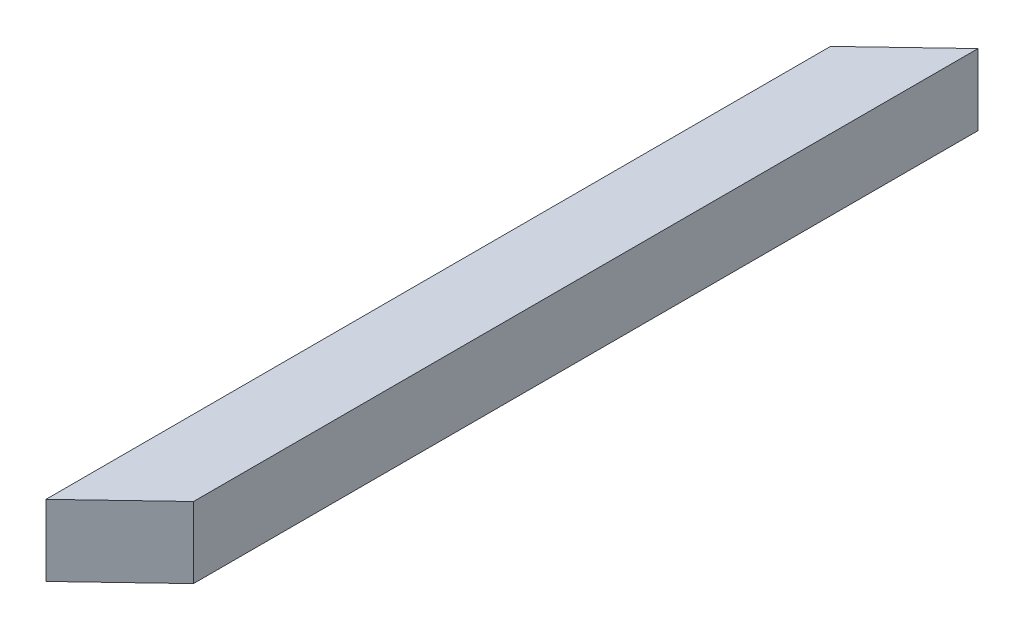
ISO-10303-21;
HEADER;
FILE_DESCRIPTION(('STEP AP214'),'2;1');
FILE_NAME('part.step','',(''),(''),'','','');
FILE_SCHEMA(('AUTOMOTIVE_DESIGN { 1 0 10303 214 1 1 1 1 }'));
ENDSEC;
DATA;
#1=APPLICATION_CONTEXT('core data for automotive mechanical design processes');
#2=APPLICATION_PROTOCOL_DEFINITION('international standard','automotive_design',2000,#1);
#3=PRODUCT_CONTEXT('',#1,'mechanical');
#4=PRODUCT('Part','Part','',(#3));
#5=PRODUCT_RELATED_PRODUCT_CATEGORY('part','',(#4));
#6=PRODUCT_DEFINITION_FORMATION('','',#4);
#7=PRODUCT_DEFINITION_CONTEXT('part definition',#1,'design');
#8=PRODUCT_DEFINITION('design','',#6,#7);
#9=PRODUCT_DEFINITION_SHAPE('','',#8);
#10=(LENGTH_UNIT() NAMED_UNIT(*) SI_UNIT(.MILLI.,.METRE.));
#11=(NAMED_UNIT(*) PLANE_ANGLE_UNIT() SI_UNIT($,.RADIAN.));
#12=(NAMED_UNIT(*) SI_UNIT($,.STERADIAN.) SOLID_ANGLE_UNIT());
#13=UNCERTAINTY_MEASURE_WITH_UNIT(LENGTH_MEASURE(1.E-05),#10,'distance_accuracy_value','');
#14=(GEOMETRIC_REPRESENTATION_CONTEXT(3) GLOBAL_UNCERTAINTY_ASSIGNED_CONTEXT((#13)) GLOBAL_UNIT_ASSIGNED_CONTEXT((#10,
#11,#12)) REPRESENTATION_CONTEXT('',''));
#15=CARTESIAN_POINT('',(0.,0.,0.));
#16=DIRECTION('',(0.,0.,1.));
#17=DIRECTION('',(1.,0.,0.));
#18=AXIS2_PLACEMENT_3D('',#15,#16,#17);
#19=CARTESIAN_POINT('',(-29.8739440592949,25.9887005649717,566.));
#20=DIRECTION('',(1.,0.,0.));
#21=DIRECTION('',(0.,1.,0.));
#22=AXIS2_PLACEMENT_3D('',#19,#20,#21);
#23=PLANE('',#22);
#24=DIRECTION('',(0.,0.,-1.));
#25=VECTOR('',#24,1.);
#26=CARTESIAN_POINT('',(-29.8739440592949,25.9887005649717,566.));
#27=LINE('',#26,#25);
#28=CARTESIAN_POINT('',(-29.8739440592949,25.9887005649717,566.));
#29=VERTEX_POINT('',#28);
#30=CARTESIAN_POINT('',(-29.8739440592949,25.9887005649717,47.4792144086482));
#31=VERTEX_POINT('',#30);
#32=EDGE_CURVE('E75',#29,#31,#27,.T.);
#33=ORIENTED_EDGE('',*,*,#32,.T.);
#34=DIRECTION('',(0.,-1.,0.));
#35=VECTOR('',#34,1.);
#36=CARTESIAN_POINT('',(-29.8739440592949,28.9887005649718,47.4792144086482));
#37=LINE('',#36,#35);
#38=CARTESIAN_POINT('',(-29.8739440592949,-21.0112994350283,47.4792144086482));
#39=VERTEX_POINT('',#38);
#40=EDGE_CURVE('E84',#31,#39,#37,.T.);
#41=ORIENTED_EDGE('',*,*,#40,.T.);
#42=DIRECTION('',(0.,0.,-1.));
#43=VECTOR('',#42,1.);
#44=CARTESIAN_POINT('',(-29.8739440592949,-21.0112994350283,566.));
#45=LINE('',#44,#43);
#46=CARTESIAN_POINT('',(-29.8739440592949,-21.0112994350283,566.));
#47=VERTEX_POINT('',#46);
#48=EDGE_CURVE('E11',#47,#39,#45,.T.);
#49=ORIENTED_EDGE('',*,*,#48,.F.);
#50=DIRECTION('',(0.,-1.,0.));
#51=VECTOR('',#50,1.);
#52=CARTESIAN_POINT('',(-29.8739440592949,25.9887005649717,566.));
#53=LINE('',#52,#51);
#54=EDGE_CURVE('E67',#29,#47,#53,.T.);
#55=ORIENTED_EDGE('',*,*,#54,.F.);
#56=EDGE_LOOP('',(#33,#41,#49,#55));
#57=FACE_BOUND('',#56,.T.);
#58=ADVANCED_FACE('F33',(#57),#23,.F.);
#59=CARTESIAN_POINT('',(-29.8739440592949,-21.0112994350283,566.));
#60=DIRECTION('',(0.,1.,0.));
#61=DIRECTION('',(0.,0.,1.));
#62=AXIS2_PLACEMENT_3D('',#59,#60,#61);
#63=PLANE('',#62);
#64=DIRECTION('',(0.,0.,-1.));
#65=VECTOR('',#64,1.);
#66=CARTESIAN_POINT('',(20.1260559407051,-21.0112994350283,566.));
#67=LINE('',#66,#65);
#68=CARTESIAN_POINT('',(20.1260559407051,-21.0112994350283,518.513450403276));
#69=VERTEX_POINT('',#68);
#70=CARTESIAN_POINT('',(20.1260559407051,-21.0112994350283,0.));
#71=VERTEX_POINT('',#70);
#72=EDGE_CURVE('E41',#69,#71,#67,.T.);
#73=ORIENTED_EDGE('',*,*,#72,.F.);
#74=DIRECTION('',(0.725096826634007,0.,-0.688646928407652));
#75=VECTOR('',#74,1.);
#76=CARTESIAN_POINT('',(-29.8739440592949,-21.0112994350283,566.));
#77=LINE('',#76,#75);
#78=EDGE_CURVE('E70',#47,#69,#77,.T.);
#79=ORIENTED_EDGE('',*,*,#78,.F.);
#80=ORIENTED_EDGE('',*,*,#48,.T.);
#81=DIRECTION('',(-0.725149944919616,0.,0.688590994265158));
#82=VECTOR('',#81,1.);
#83=CARTESIAN_POINT('',(20.1260559407051,-21.0112994350283,0.));
#84=LINE('',#83,#82);
#85=EDGE_CURVE('E89',#71,#39,#84,.T.);
#86=ORIENTED_EDGE('',*,*,#85,.F.);
#87=EDGE_LOOP('',(#73,#79,#80,#86));
#88=FACE_BOUND('',#87,.T.);
#89=ADVANCED_FACE('F80',(#88),#63,.F.);
#90=CARTESIAN_POINT('',(20.1260559407051,25.9887005649717,566.));
#91=DIRECTION('',(-1.,0.,0.));
#92=DIRECTION('',(0.,-1.,0.));
#93=AXIS2_PLACEMENT_3D('',#90,#91,#92);
#94=PLANE('',#93);
#95=DIRECTION('',(0.,0.,-1.));
#96=VECTOR('',#95,1.);
#97=CARTESIAN_POINT('',(20.1260559407051,25.9887005649717,566.));
#98=LINE('',#97,#96);
#99=CARTESIAN_POINT('',(20.1260559407051,25.9887005649717,518.513450403276));
#100=VERTEX_POINT('',#99);
#101=CARTESIAN_POINT('',(20.1260559407051,25.9887005649717,0.));
#102=VERTEX_POINT('',#101);
#103=EDGE_CURVE('E100',#100,#102,#98,.T.);
#104=ORIENTED_EDGE('',*,*,#103,.F.);
#105=DIRECTION('',(0.,-1.,0.));
#106=VECTOR('',#105,1.);
#107=CARTESIAN_POINT('',(20.1260559407051,28.9887005649718,518.513450403276));
#108=LINE('',#107,#106);
#109=EDGE_CURVE('E83',#100,#69,#108,.T.);
#110=ORIENTED_EDGE('',*,*,#109,.T.);
#111=ORIENTED_EDGE('',*,*,#72,.T.);
#112=DIRECTION('',(0.,1.,0.));
#113=VECTOR('',#112,1.);
#114=CARTESIAN_POINT('',(20.1260559407051,25.9887005649717,0.));
#115=LINE('',#114,#113);
#116=EDGE_CURVE('E76',#71,#102,#115,.T.);
#117=ORIENTED_EDGE('',*,*,#116,.T.);
#118=EDGE_LOOP('',(#104,#110,#111,#117));
#119=FACE_BOUND('',#118,.T.);
#120=ADVANCED_FACE('F104',(#119),#94,.F.);
#121=CARTESIAN_POINT('',(-29.8739440592949,25.9887005649717,566.));
#122=DIRECTION('',(0.,-1.,0.));
#123=DIRECTION('',(0.,0.,-1.));
#124=AXIS2_PLACEMENT_3D('',#121,#122,#123);
#125=PLANE('',#124);
#126=ORIENTED_EDGE('',*,*,#32,.F.);
#127=DIRECTION('',(0.725096826634007,0.,-0.688646928407652));
#128=VECTOR('',#127,1.);
#129=CARTESIAN_POINT('',(-29.8739440592949,25.9887005649717,566.));
#130=LINE('',#129,#128);
#131=EDGE_CURVE('E47',#29,#100,#130,.T.);
#132=ORIENTED_EDGE('',*,*,#131,.T.);
#133=ORIENTED_EDGE('',*,*,#103,.T.);
#134=DIRECTION('',(-0.725149944919616,0.,0.688590994265158));
#135=VECTOR('',#134,1.);
#136=CARTESIAN_POINT('',(-288.787820595095,25.9887005649717,293.339763556998));
#137=LINE('',#136,#135);
#138=EDGE_CURVE('E94',#102,#31,#137,.T.);
#139=ORIENTED_EDGE('',*,*,#138,.T.);
#140=EDGE_LOOP('',(#126,#132,#133,#139));
#141=FACE_BOUND('',#140,.T.);
#142=ADVANCED_FACE('F106',(#141),#125,.F.);
#143=CARTESIAN_POINT('',(20.1260559407051,28.9887005649718,0.));
#144=DIRECTION('',(0.688590994265158,0.,0.725149944919616));
#145=DIRECTION('',(0.725149944919616,0.,-0.688590994265158));
#146=AXIS2_PLACEMENT_3D('',#143,#144,#145);
#147=PLANE('',#146);
#148=ORIENTED_EDGE('',*,*,#116,.F.);
#149=ORIENTED_EDGE('',*,*,#85,.T.);
#150=ORIENTED_EDGE('',*,*,#40,.F.);
#151=ORIENTED_EDGE('',*,*,#138,.F.);
#152=EDGE_LOOP('',(#148,#149,#150,#151));
#153=FACE_BOUND('',#152,.T.);
#154=ADVANCED_FACE('F107',(#153),#147,.F.);
#155=CARTESIAN_POINT('',(-29.8739440592949,28.9887005649718,566.));
#156=DIRECTION('',(-0.688646928407652,0.,-0.725096826634007));
#157=DIRECTION('',(-0.725096826634007,0.,0.688646928407652));
#158=AXIS2_PLACEMENT_3D('',#155,#156,#157);
#159=PLANE('',#158);
#160=ORIENTED_EDGE('',*,*,#54,.T.);
#161=ORIENTED_EDGE('',*,*,#78,.T.);
#162=ORIENTED_EDGE('',*,*,#109,.F.);
#163=ORIENTED_EDGE('',*,*,#131,.F.);
#164=EDGE_LOOP('',(#160,#161,#162,#163));
#165=FACE_BOUND('',#164,.T.);
#166=ADVANCED_FACE('F69',(#165),#159,.F.);
#167=CLOSED_SHELL('',(#58,#89,#120,#142,#154,#166));
#168=MANIFOLD_SOLID_BREP('B2',#167);
#169=ADVANCED_BREP_SHAPE_REPRESENTATION('',(#18,#168),#14);
#170=SHAPE_DEFINITION_REPRESENTATION(#9,#169);
ENDSEC;
END-ISO-10303-21;
